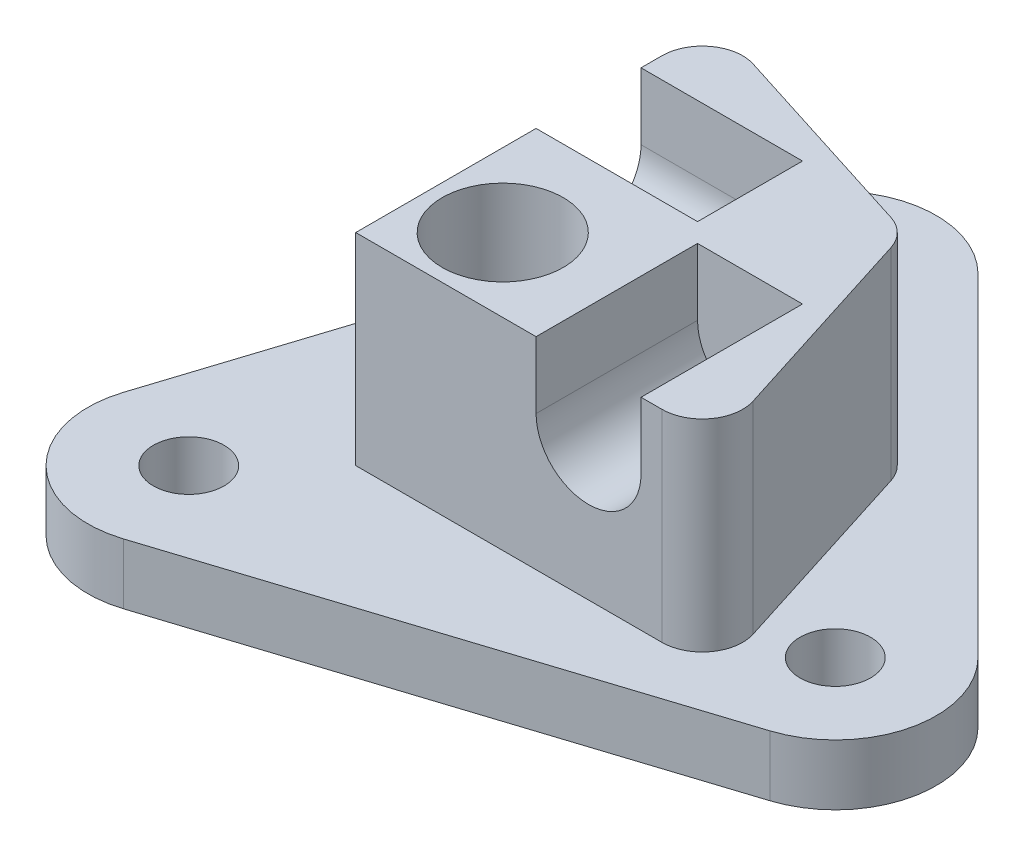
ISO-10303-21;
HEADER;
FILE_DESCRIPTION(('STEP AP214'),'2;1');
FILE_NAME('part.step','',(''),(''),'','','');
FILE_SCHEMA(('AUTOMOTIVE_DESIGN { 1 0 10303 214 1 1 1 1 }'));
ENDSEC;
DATA;
#1=APPLICATION_CONTEXT('core data for automotive mechanical design processes');
#2=APPLICATION_PROTOCOL_DEFINITION('international standard','automotive_design',2000,#1);
#3=PRODUCT_CONTEXT('',#1,'mechanical');
#4=PRODUCT('Part','Part','',(#3));
#5=PRODUCT_RELATED_PRODUCT_CATEGORY('part','',(#4));
#6=PRODUCT_DEFINITION_FORMATION('','',#4);
#7=PRODUCT_DEFINITION_CONTEXT('part definition',#1,'design');
#8=PRODUCT_DEFINITION('design','',#6,#7);
#9=PRODUCT_DEFINITION_SHAPE('','',#8);
#10=(LENGTH_UNIT() NAMED_UNIT(*) SI_UNIT(.MILLI.,.METRE.));
#11=(NAMED_UNIT(*) PLANE_ANGLE_UNIT() SI_UNIT($,.RADIAN.));
#12=(NAMED_UNIT(*) SI_UNIT($,.STERADIAN.) SOLID_ANGLE_UNIT());
#13=UNCERTAINTY_MEASURE_WITH_UNIT(LENGTH_MEASURE(1.E-05),#10,'distance_accuracy_value','');
#14=(GEOMETRIC_REPRESENTATION_CONTEXT(3) GLOBAL_UNCERTAINTY_ASSIGNED_CONTEXT((#13)) GLOBAL_UNIT_ASSIGNED_CONTEXT((#10,
#11,#12)) REPRESENTATION_CONTEXT('',''));
#15=CARTESIAN_POINT('',(0.,0.,0.));
#16=DIRECTION('',(0.,0.,1.));
#17=DIRECTION('',(1.,0.,0.));
#18=AXIS2_PLACEMENT_3D('',#15,#16,#17);
#19=CARTESIAN_POINT('',(0.,13.,-10.493));
#20=DIRECTION('',(0.,0.,1.));
#21=DIRECTION('',(1.,0.,0.));
#22=AXIS2_PLACEMENT_3D('',#19,#20,#21);
#23=PLANE('',#22);
#24=DIRECTION('',(0.,-1.,0.));
#25=VECTOR('',#24,1.);
#26=CARTESIAN_POINT('',(-3.64159276239827,13.,-10.493));
#27=LINE('',#26,#25);
#28=CARTESIAN_POINT('',(-3.64159276239827,13.,-10.493));
#29=VERTEX_POINT('',#28);
#30=CARTESIAN_POINT('',(-3.64159276239826,9.7,-10.493));
#31=VERTEX_POINT('',#30);
#32=EDGE_CURVE('E194',#29,#31,#27,.T.);
#33=ORIENTED_EDGE('',*,*,#32,.T.);
#34=DIRECTION('',(-1.,0.,0.));
#35=VECTOR('',#34,1.);
#36=CARTESIAN_POINT('',(21.4761737880842,9.7,-10.493));
#37=LINE('',#36,#35);
#38=CARTESIAN_POINT('',(4.35840723760174,9.7,-10.493));
#39=VERTEX_POINT('',#38);
#40=EDGE_CURVE('E180',#39,#31,#37,.T.);
#41=ORIENTED_EDGE('',*,*,#40,.F.);
#42=DIRECTION('',(0.,-1.,0.));
#43=VECTOR('',#42,1.);
#44=CARTESIAN_POINT('',(4.35840723760173,13.,-10.493));
#45=LINE('',#44,#43);
#46=CARTESIAN_POINT('',(4.35840723760173,13.,-10.493));
#47=VERTEX_POINT('',#46);
#48=EDGE_CURVE('E191',#47,#39,#45,.T.);
#49=ORIENTED_EDGE('',*,*,#48,.F.);
#50=DIRECTION('',(-1.,0.,0.));
#51=VECTOR('',#50,1.);
#52=CARTESIAN_POINT('',(0.,13.,-10.493));
#53=LINE('',#52,#51);
#54=EDGE_CURVE('E628',#47,#29,#53,.T.);
#55=ORIENTED_EDGE('',*,*,#54,.T.);
#56=EDGE_LOOP('',(#33,#41,#49,#55));
#57=FACE_BOUND('',#56,.T.);
#58=ADVANCED_FACE('F38',(#57),#23,.T.);
#59=CARTESIAN_POINT('',(0.,13.,-5.29300000000001));
#60=DIRECTION('',(0.,0.,1.));
#61=DIRECTION('',(1.,0.,0.));
#62=AXIS2_PLACEMENT_3D('',#59,#60,#61);
#63=PLANE('',#62);
#64=DIRECTION('',(-1.,0.,0.));
#65=VECTOR('',#64,1.);
#66=CARTESIAN_POINT('',(21.4761737880842,9.7,-5.293));
#67=LINE('',#66,#65);
#68=CARTESIAN_POINT('',(4.35840723760175,9.7,-5.293));
#69=VERTEX_POINT('',#68);
#70=CARTESIAN_POINT('',(-3.64159276239826,9.7,-5.293));
#71=VERTEX_POINT('',#70);
#72=EDGE_CURVE('E183',#69,#71,#67,.T.);
#73=ORIENTED_EDGE('',*,*,#72,.T.);
#74=DIRECTION('',(0.,-1.,0.));
#75=VECTOR('',#74,1.);
#76=CARTESIAN_POINT('',(-3.64159276239827,13.,-5.29300000000001));
#77=LINE('',#76,#75);
#78=CARTESIAN_POINT('',(-3.64159276239827,13.,-5.29300000000001));
#79=VERTEX_POINT('',#78);
#80=EDGE_CURVE('E205',#79,#71,#77,.T.);
#81=ORIENTED_EDGE('',*,*,#80,.F.);
#82=DIRECTION('',(-1.,0.,0.));
#83=VECTOR('',#82,1.);
#84=CARTESIAN_POINT('',(0.,13.,-5.29300000000001));
#85=LINE('',#84,#83);
#86=CARTESIAN_POINT('',(4.35840723760173,13.,-5.29300000000001));
#87=VERTEX_POINT('',#86);
#88=EDGE_CURVE('E616',#87,#79,#85,.T.);
#89=ORIENTED_EDGE('',*,*,#88,.F.);
#90=DIRECTION('',(0.,-1.,0.));
#91=VECTOR('',#90,1.);
#92=CARTESIAN_POINT('',(4.35840723760173,13.,-5.29300000000001));
#93=LINE('',#92,#91);
#94=EDGE_CURVE('E201',#87,#69,#93,.T.);
#95=ORIENTED_EDGE('',*,*,#94,.T.);
#96=EDGE_LOOP('',(#73,#81,#89,#95));
#97=FACE_BOUND('',#96,.T.);
#98=ADVANCED_FACE('F316',(#97),#63,.F.);
#99=CARTESIAN_POINT('',(0.,13.,-4.35840723760174));
#100=DIRECTION('',(0.,0.,-1.));
#101=DIRECTION('',(-1.,0.,0.));
#102=AXIS2_PLACEMENT_3D('',#99,#100,#101);
#103=PLANE('',#102);
#104=CARTESIAN_POINT('',(7.893,9.7,-4.35840723760174));
#105=DIRECTION('',(0.,0.,-1.));
#106=DIRECTION('',(-1.,0.,0.));
#107=AXIS2_PLACEMENT_3D('',#104,#105,#106);
#108=CIRCLE('',#107,2.6);
#109=CARTESIAN_POINT('',(5.293,9.7,-4.35840723760174));
#110=VERTEX_POINT('',#109);
#111=CARTESIAN_POINT('',(10.493,9.7,-4.35840723760174));
#112=VERTEX_POINT('',#111);
#113=EDGE_CURVE('E581',#110,#112,#108,.F.);
#114=ORIENTED_EDGE('',*,*,#113,.T.);
#115=DIRECTION('',(0.,-1.,0.));
#116=VECTOR('',#115,1.);
#117=CARTESIAN_POINT('',(10.493,13.,-4.35840723760174));
#118=LINE('',#117,#116);
#119=CARTESIAN_POINT('',(10.493,13.,-4.35840723760174));
#120=VERTEX_POINT('',#119);
#121=EDGE_CURVE('E602',#120,#112,#118,.T.);
#122=ORIENTED_EDGE('',*,*,#121,.F.);
#123=DIRECTION('',(1.,0.,0.));
#124=VECTOR('',#123,1.);
#125=CARTESIAN_POINT('',(0.,13.,-4.35840723760174));
#126=LINE('',#125,#124);
#127=CARTESIAN_POINT('',(5.293,13.,-4.35840723760174));
#128=VERTEX_POINT('',#127);
#129=EDGE_CURVE('E600',#128,#120,#126,.T.);
#130=ORIENTED_EDGE('',*,*,#129,.F.);
#131=DIRECTION('',(0.,-1.,0.));
#132=VECTOR('',#131,1.);
#133=CARTESIAN_POINT('',(5.293,13.,-4.35840723760174));
#134=LINE('',#133,#132);
#135=EDGE_CURVE('E594',#128,#110,#134,.T.);
#136=ORIENTED_EDGE('',*,*,#135,.T.);
#137=EDGE_LOOP('',(#114,#122,#130,#136));
#138=FACE_BOUND('',#137,.T.);
#139=ADVANCED_FACE('F321',(#138),#103,.F.);
#140=CARTESIAN_POINT('',(-7.77817459305202,3.,7.77817459305203));
#141=DIRECTION('',(0.,-1.,0.));
#142=DIRECTION('',(0.,0.,-1.));
#143=AXIS2_PLACEMENT_3D('',#140,#141,#142);
#144=CYLINDRICAL_SURFACE('',#143,5.);
#145=CARTESIAN_POINT('',(-7.77817459305202,0.,7.77817459305203));
#146=DIRECTION('',(0.,1.,0.));
#147=DIRECTION('',(0.,0.,1.));
#148=AXIS2_PLACEMENT_3D('',#145,#146,#147);
#149=CIRCLE('',#148,5.);
#150=CARTESIAN_POINT('',(-6.25119356190471,0.,12.539301448169));
#151=VERTEX_POINT('',#150);
#152=CARTESIAN_POINT('',(-12.539301448169,0.,6.25119356190473));
#153=VERTEX_POINT('',#152);
#154=EDGE_CURVE('E243',#151,#153,#149,.F.);
#155=ORIENTED_EDGE('',*,*,#154,.F.);
#156=DIRECTION('',(0.,-1.,0.));
#157=VECTOR('',#156,1.);
#158=CARTESIAN_POINT('',(-6.25119356190471,3.,12.539301448169));
#159=LINE('',#158,#157);
#160=CARTESIAN_POINT('',(-6.25119356190471,3.,12.539301448169));
#161=VERTEX_POINT('',#160);
#162=EDGE_CURVE('E11',#161,#151,#159,.T.);
#163=ORIENTED_EDGE('',*,*,#162,.F.);
#164=CARTESIAN_POINT('',(-7.77817459305202,3.,7.77817459305203));
#165=DIRECTION('',(0.,1.,0.));
#166=DIRECTION('',(0.,0.,1.));
#167=AXIS2_PLACEMENT_3D('',#164,#165,#166);
#168=CIRCLE('',#167,5.);
#169=CARTESIAN_POINT('',(-12.539301448169,3.,6.25119356190473));
#170=VERTEX_POINT('',#169);
#171=EDGE_CURVE('E218',#161,#170,#168,.F.);
#172=ORIENTED_EDGE('',*,*,#171,.T.);
#173=DIRECTION('',(0.,-1.,0.));
#174=VECTOR('',#173,1.);
#175=CARTESIAN_POINT('',(-12.539301448169,3.,6.25119356190473));
#176=LINE('',#175,#174);
#177=EDGE_CURVE('E237',#170,#153,#176,.T.);
#178=ORIENTED_EDGE('',*,*,#177,.T.);
#179=EDGE_LOOP('',(#155,#163,#172,#178));
#180=FACE_BOUND('',#179,.T.);
#181=ADVANCED_FACE('F287',(#180),#144,.T.);
#182=CARTESIAN_POINT('',(3.06347520775995,3.,9.5519156977955));
#183=DIRECTION('',(-0.305396206229444,0.,-0.952225371023406));
#184=DIRECTION('',(-0.952225371023406,0.,0.305396206229444));
#185=AXIS2_PLACEMENT_3D('',#182,#183,#184);
#186=PLANE('',#185);
#187=DIRECTION('',(0.952225371023406,0.,-0.305396206229444));
#188=VECTOR('',#187,1.);
#189=CARTESIAN_POINT('',(3.06347520775995,0.,9.5519156977955));
#190=LINE('',#189,#188);
#191=CARTESIAN_POINT('',(18.0011548192313,0.,4.76112685511704));
#192=VERTEX_POINT('',#191);
#193=EDGE_CURVE('E246',#151,#192,#190,.T.);
#194=ORIENTED_EDGE('',*,*,#193,.T.);
#195=DIRECTION('',(0.,-1.,0.));
#196=VECTOR('',#195,1.);
#197=CARTESIAN_POINT('',(18.0011548192313,3.,4.76112685511704));
#198=LINE('',#197,#196);
#199=CARTESIAN_POINT('',(18.0011548192313,3.,4.76112685511704));
#200=VERTEX_POINT('',#199);
#201=EDGE_CURVE('E46',#200,#192,#198,.T.);
#202=ORIENTED_EDGE('',*,*,#201,.F.);
#203=DIRECTION('',(0.952225371023406,0.,-0.305396206229444));
#204=VECTOR('',#203,1.);
#205=CARTESIAN_POINT('',(3.06347520775995,3.,9.5519156977955));
#206=LINE('',#205,#204);
#207=EDGE_CURVE('E221',#161,#200,#206,.T.);
#208=ORIENTED_EDGE('',*,*,#207,.F.);
#209=ORIENTED_EDGE('',*,*,#162,.T.);
#210=EDGE_LOOP('',(#194,#202,#208,#209));
#211=FACE_BOUND('',#210,.T.);
#212=ADVANCED_FACE('F281',(#211),#186,.F.);
#213=CARTESIAN_POINT('',(16.4741737880842,3.,0.));
#214=DIRECTION('',(0.,-1.,0.));
#215=DIRECTION('',(0.,0.,-1.));
#216=AXIS2_PLACEMENT_3D('',#213,#214,#215);
#217=CYLINDRICAL_SURFACE('',#216,5.);
#218=CARTESIAN_POINT('',(16.4741737880842,0.,0.));
#219=DIRECTION('',(0.,1.,0.));
#220=DIRECTION('',(0.,0.,1.));
#221=AXIS2_PLACEMENT_3D('',#218,#219,#220);
#222=CIRCLE('',#221,5.);
#223=CARTESIAN_POINT('',(20.0097076940169,0.,-3.53553390593279));
#224=VERTEX_POINT('',#223);
#225=EDGE_CURVE('E249',#192,#224,#222,.T.);
#226=ORIENTED_EDGE('',*,*,#225,.T.);
#227=DIRECTION('',(0.,-1.,0.));
#228=VECTOR('',#227,1.);
#229=CARTESIAN_POINT('',(20.0097076940169,3.,-3.53553390593279));
#230=LINE('',#229,#228);
#231=CARTESIAN_POINT('',(20.0097076940169,3.,-3.53553390593279));
#232=VERTEX_POINT('',#231);
#233=EDGE_CURVE('E272',#232,#224,#230,.T.);
#234=ORIENTED_EDGE('',*,*,#233,.F.);
#235=CARTESIAN_POINT('',(16.4741737880842,3.,0.));
#236=DIRECTION('',(0.,1.,0.));
#237=DIRECTION('',(0.,0.,1.));
#238=AXIS2_PLACEMENT_3D('',#235,#236,#237);
#239=CIRCLE('',#238,5.);
#240=EDGE_CURVE('E224',#200,#232,#239,.T.);
#241=ORIENTED_EDGE('',*,*,#240,.F.);
#242=ORIENTED_EDGE('',*,*,#201,.T.);
#243=EDGE_LOOP('',(#226,#234,#241,#242));
#244=FACE_BOUND('',#243,.T.);
#245=ADVANCED_FACE('F276',(#244),#217,.T.);
#246=CARTESIAN_POINT('',(11.7726207999748,3.,-11.7726207999748));
#247=DIRECTION('',(0.707106781186547,0.,-0.707106781186547));
#248=DIRECTION('',(-0.707106781186548,0.,-0.707106781186548));
#249=AXIS2_PLACEMENT_3D('',#246,#247,#248);
#250=PLANE('',#249);
#251=DIRECTION('',(0.707106781186548,0.,0.707106781186548));
#252=VECTOR('',#251,1.);
#253=CARTESIAN_POINT('',(11.7726207999748,0.,-11.7726207999748));
#254=LINE('',#253,#252);
#255=CARTESIAN_POINT('',(3.53553390593278,0.,-20.0097076940169));
#256=VERTEX_POINT('',#255);
#257=EDGE_CURVE('E252',#256,#224,#254,.T.);
#258=ORIENTED_EDGE('',*,*,#257,.F.);
#259=DIRECTION('',(0.,-1.,0.));
#260=VECTOR('',#259,1.);
#261=CARTESIAN_POINT('',(3.53553390593278,3.,-20.0097076940169));
#262=LINE('',#261,#260);
#263=CARTESIAN_POINT('',(3.53553390593278,3.,-20.0097076940169));
#264=VERTEX_POINT('',#263);
#265=EDGE_CURVE('E270',#264,#256,#262,.T.);
#266=ORIENTED_EDGE('',*,*,#265,.F.);
#267=DIRECTION('',(0.707106781186548,0.,0.707106781186548));
#268=VECTOR('',#267,1.);
#269=CARTESIAN_POINT('',(11.7726207999748,3.,-11.7726207999748));
#270=LINE('',#269,#268);
#271=EDGE_CURVE('E226',#264,#232,#270,.T.);
#272=ORIENTED_EDGE('',*,*,#271,.T.);
#273=ORIENTED_EDGE('',*,*,#233,.T.);
#274=EDGE_LOOP('',(#258,#266,#272,#273));
#275=FACE_BOUND('',#274,.T.);
#276=ADVANCED_FACE('F297',(#275),#250,.T.);
#277=CARTESIAN_POINT('',(0.,3.,-16.4741737880842));
#278=DIRECTION('',(0.,-1.,0.));
#279=DIRECTION('',(0.,0.,-1.));
#280=AXIS2_PLACEMENT_3D('',#277,#278,#279);
#281=CYLINDRICAL_SURFACE('',#280,5.);
#282=CARTESIAN_POINT('',(0.,0.,-16.4741737880842));
#283=DIRECTION('',(0.,1.,0.));
#284=DIRECTION('',(0.,0.,1.));
#285=AXIS2_PLACEMENT_3D('',#282,#283,#284);
#286=CIRCLE('',#285,5.);
#287=CARTESIAN_POINT('',(-4.76112685511705,0.,-18.0011548192313));
#288=VERTEX_POINT('',#287);
#289=EDGE_CURVE('E255',#256,#288,#286,.T.);
#290=ORIENTED_EDGE('',*,*,#289,.T.);
#291=DIRECTION('',(0.,-1.,0.));
#292=VECTOR('',#291,1.);
#293=CARTESIAN_POINT('',(-4.76112685511705,3.,-18.0011548192313));
#294=LINE('',#293,#292);
#295=CARTESIAN_POINT('',(-4.76112685511705,3.,-18.0011548192313));
#296=VERTEX_POINT('',#295);
#297=EDGE_CURVE('E267',#296,#288,#294,.T.);
#298=ORIENTED_EDGE('',*,*,#297,.F.);
#299=CARTESIAN_POINT('',(0.,3.,-16.4741737880842));
#300=DIRECTION('',(0.,1.,0.));
#301=DIRECTION('',(0.,0.,1.));
#302=AXIS2_PLACEMENT_3D('',#299,#300,#301);
#303=CIRCLE('',#302,5.);
#304=EDGE_CURVE('E229',#264,#296,#303,.T.);
#305=ORIENTED_EDGE('',*,*,#304,.F.);
#306=ORIENTED_EDGE('',*,*,#265,.T.);
#307=EDGE_LOOP('',(#290,#298,#305,#306));
#308=FACE_BOUND('',#307,.T.);
#309=ADVANCED_FACE('F303',(#308),#281,.T.);
#310=CARTESIAN_POINT('',(0.,3.,-16.4741737880842));
#311=DIRECTION('',(0.,-1.,0.));
#312=DIRECTION('',(0.,0.,-1.));
#313=AXIS2_PLACEMENT_3D('',#310,#311,#312);
#314=CYLINDRICAL_SURFACE('',#313,1.75);
#315=CARTESIAN_POINT('',(0.,3.,-16.4741737880842));
#316=DIRECTION('',(0.,1.,0.));
#317=DIRECTION('',(0.,0.,1.));
#318=AXIS2_PLACEMENT_3D('',#315,#316,#317);
#319=CIRCLE('',#318,1.75);
#320=CARTESIAN_POINT('',(0.,3.,-14.7241737880842));
#321=VERTEX_POINT('',#320);
#322=EDGE_CURVE('E234',#321,#321,#319,.F.);
#323=ORIENTED_EDGE('',*,*,#322,.F.);
#324=EDGE_LOOP('',(#323));
#325=FACE_BOUND('',#324,.T.);
#326=CARTESIAN_POINT('',(0.,0.,-16.4741737880842));
#327=DIRECTION('',(0.,1.,0.));
#328=DIRECTION('',(0.,0.,1.));
#329=AXIS2_PLACEMENT_3D('',#326,#327,#328);
#330=CIRCLE('',#329,1.75);
#331=CARTESIAN_POINT('',(0.,0.,-14.7241737880842));
#332=VERTEX_POINT('',#331);
#333=EDGE_CURVE('E261',#332,#332,#330,.F.);
#334=ORIENTED_EDGE('',*,*,#333,.T.);
#335=EDGE_LOOP('',(#334));
#336=FACE_BOUND('',#335,.T.);
#337=ADVANCED_FACE('F305',(#325,#336),#314,.F.);
#338=CARTESIAN_POINT('',(-9.55191569779549,3.,-3.06347520775994));
#339=DIRECTION('',(0.952225371023406,0.,0.305396206229444));
#340=DIRECTION('',(0.305396206229444,0.,-0.952225371023406));
#341=AXIS2_PLACEMENT_3D('',#338,#339,#340);
#342=PLANE('',#341);
#343=DIRECTION('',(-0.305396206229444,0.,0.952225371023406));
#344=VECTOR('',#343,1.);
#345=CARTESIAN_POINT('',(-9.55191569779549,0.,-3.06347520775994));
#346=LINE('',#345,#344);
#347=EDGE_CURVE('E258',#288,#153,#346,.T.);
#348=ORIENTED_EDGE('',*,*,#347,.T.);
#349=ORIENTED_EDGE('',*,*,#177,.F.);
#350=DIRECTION('',(-0.305396206229444,0.,0.952225371023406));
#351=VECTOR('',#350,1.);
#352=CARTESIAN_POINT('',(-9.55191569779549,3.,-3.06347520775994));
#353=LINE('',#352,#351);
#354=EDGE_CURVE('E232',#296,#170,#353,.T.);
#355=ORIENTED_EDGE('',*,*,#354,.F.);
#356=ORIENTED_EDGE('',*,*,#297,.T.);
#357=EDGE_LOOP('',(#348,#349,#355,#356));
#358=FACE_BOUND('',#357,.T.);
#359=ADVANCED_FACE('F291',(#358),#342,.F.);
#360=CARTESIAN_POINT('',(-7.77817459305202,3.,7.77817459305203));
#361=DIRECTION('',(0.,-1.,0.));
#362=DIRECTION('',(0.,0.,-1.));
#363=AXIS2_PLACEMENT_3D('',#360,#361,#362);
#364=CYLINDRICAL_SURFACE('',#363,1.75);
#365=CARTESIAN_POINT('',(-7.77817459305202,3.,7.77817459305203));
#366=DIRECTION('',(0.,1.,0.));
#367=DIRECTION('',(0.,0.,1.));
#368=AXIS2_PLACEMENT_3D('',#365,#366,#367);
#369=CIRCLE('',#368,1.75);
#370=CARTESIAN_POINT('',(-7.77817459305202,3.,9.52817459305203));
#371=VERTEX_POINT('',#370);
#372=EDGE_CURVE('E214',#371,#371,#369,.T.);
#373=ORIENTED_EDGE('',*,*,#372,.T.);
#374=EDGE_LOOP('',(#373));
#375=FACE_BOUND('',#374,.T.);
#376=CARTESIAN_POINT('',(-7.77817459305202,0.,7.77817459305203));
#377=DIRECTION('',(0.,1.,0.));
#378=DIRECTION('',(0.,0.,1.));
#379=AXIS2_PLACEMENT_3D('',#376,#377,#378);
#380=CIRCLE('',#379,1.75);
#381=CARTESIAN_POINT('',(-7.77817459305202,0.,9.52817459305203));
#382=VERTEX_POINT('',#381);
#383=EDGE_CURVE('E240',#382,#382,#380,.T.);
#384=ORIENTED_EDGE('',*,*,#383,.F.);
#385=EDGE_LOOP('',(#384));
#386=FACE_BOUND('',#385,.T.);
#387=ADVANCED_FACE('F342',(#375,#386),#364,.F.);
#388=CARTESIAN_POINT('',(16.4741737880842,3.,0.));
#389=DIRECTION('',(0.,-1.,0.));
#390=DIRECTION('',(0.,0.,-1.));
#391=AXIS2_PLACEMENT_3D('',#388,#389,#390);
#392=CYLINDRICAL_SURFACE('',#391,1.75);
#393=CARTESIAN_POINT('',(16.4741737880842,3.,0.));
#394=DIRECTION('',(0.,1.,0.));
#395=DIRECTION('',(0.,0.,1.));
#396=AXIS2_PLACEMENT_3D('',#393,#394,#395);
#397=CIRCLE('',#396,1.75);
#398=CARTESIAN_POINT('',(16.4741737880842,3.,1.75));
#399=VERTEX_POINT('',#398);
#400=EDGE_CURVE('E211',#399,#399,#397,.T.);
#401=ORIENTED_EDGE('',*,*,#400,.T.);
#402=EDGE_LOOP('',(#401));
#403=FACE_BOUND('',#402,.T.);
#404=CARTESIAN_POINT('',(16.4741737880842,0.,0.));
#405=DIRECTION('',(0.,1.,0.));
#406=DIRECTION('',(0.,0.,1.));
#407=AXIS2_PLACEMENT_3D('',#404,#405,#406);
#408=CIRCLE('',#407,1.75);
#409=CARTESIAN_POINT('',(16.4741737880842,0.,1.75));
#410=VERTEX_POINT('',#409);
#411=EDGE_CURVE('E210',#410,#410,#408,.T.);
#412=ORIENTED_EDGE('',*,*,#411,.F.);
#413=EDGE_LOOP('',(#412));
#414=FACE_BOUND('',#413,.T.);
#415=ADVANCED_FACE('F40',(#403,#414),#392,.F.);
#416=CARTESIAN_POINT('',(0.,3.,0.));
#417=DIRECTION('',(0.,-1.,0.));
#418=DIRECTION('',(0.,0.,-1.));
#419=AXIS2_PLACEMENT_3D('',#416,#417,#418);
#420=CYLINDRICAL_SURFACE('',#419,3.);
#421=CARTESIAN_POINT('',(0.,0.,0.));
#422=DIRECTION('',(0.,1.,0.));
#423=DIRECTION('',(0.,0.,1.));
#424=AXIS2_PLACEMENT_3D('',#421,#422,#423);
#425=CIRCLE('',#424,3.);
#426=CARTESIAN_POINT('',(0.,0.,3.));
#427=VERTEX_POINT('',#426);
#428=EDGE_CURVE('E215',#427,#427,#425,.T.);
#429=ORIENTED_EDGE('',*,*,#428,.F.);
#430=EDGE_LOOP('',(#429));
#431=FACE_BOUND('',#430,.T.);
#432=CARTESIAN_POINT('',(0.,13.,0.));
#433=DIRECTION('',(0.,1.,0.));
#434=DIRECTION('',(0.,0.,1.));
#435=AXIS2_PLACEMENT_3D('',#432,#433,#434);
#436=CIRCLE('',#435,3.);
#437=CARTESIAN_POINT('',(0.,13.,3.));
#438=VERTEX_POINT('',#437);
#439=EDGE_CURVE('E652',#438,#438,#436,.F.);
#440=ORIENTED_EDGE('',*,*,#439,.F.);
#441=EDGE_LOOP('',(#440));
#442=FACE_BOUND('',#441,.T.);
#443=ADVANCED_FACE('F335',(#431,#442),#420,.F.);
#444=CARTESIAN_POINT('',(0.,3.,0.));
#445=DIRECTION('',(0.,1.,0.));
#446=DIRECTION('',(0.,0.,1.));
#447=AXIS2_PLACEMENT_3D('',#444,#445,#446);
#448=PLANE('',#447);
#449=DIRECTION('',(1.,0.,0.));
#450=VECTOR('',#449,1.);
#451=CARTESIAN_POINT('',(0.,3.,3.64159276239826));
#452=LINE('',#451,#450);
#453=CARTESIAN_POINT('',(-3.64159276239827,3.,3.64159276239826));
#454=VERTEX_POINT('',#453);
#455=CARTESIAN_POINT('',(11.5299801128555,3.,3.64159276239826));
#456=VERTEX_POINT('',#455);
#457=EDGE_CURVE('E658',#454,#456,#452,.T.);
#458=ORIENTED_EDGE('',*,*,#457,.F.);
#459=DIRECTION('',(0.,0.,1.));
#460=VECTOR('',#459,1.);
#461=CARTESIAN_POINT('',(-3.64159276239827,3.,0.));
#462=LINE('',#461,#460);
#463=CARTESIAN_POINT('',(-3.64159276239827,3.,-11.5299801128555));
#464=VERTEX_POINT('',#463);
#465=EDGE_CURVE('E53',#464,#454,#462,.T.);
#466=ORIENTED_EDGE('',*,*,#465,.F.);
#467=CARTESIAN_POINT('',(-1.64159276239827,3.,-11.5299801128555));
#468=DIRECTION('',(0.,1.,0.));
#469=DIRECTION('',(0.,0.,1.));
#470=AXIS2_PLACEMENT_3D('',#467,#468,#469);
#471=CIRCLE('',#470,2.);
#472=CARTESIAN_POINT('',(-1.03695933041488,3.,-13.4363951812307));
#473=VERTEX_POINT('',#472);
#474=EDGE_CURVE('E590',#464,#473,#471,.F.);
#475=ORIENTED_EDGE('',*,*,#474,.T.);
#476=DIRECTION('',(0.953207534187596,0.,0.302316715991695));
#477=VECTOR('',#476,1.);
#478=CARTESIAN_POINT('',(3.77720036741712,3.,-11.9095493497523));
#479=LINE('',#478,#477);
#480=CARTESIAN_POINT('',(8.96304066958512,3.,-10.2648223059769));
#481=VERTEX_POINT('',#480);
#482=EDGE_CURVE('E626',#473,#481,#479,.T.);
#483=ORIENTED_EDGE('',*,*,#482,.T.);
#484=CARTESIAN_POINT('',(8.35840723760173,3.,-8.35840723760174));
#485=DIRECTION('',(0.,1.,0.));
#486=DIRECTION('',(0.,0.,1.));
#487=AXIS2_PLACEMENT_3D('',#484,#485,#486);
#488=CIRCLE('',#487,2.);
#489=CARTESIAN_POINT('',(10.2648223059769,3.,-8.96304066958512));
#490=VERTEX_POINT('',#489);
#491=EDGE_CURVE('E666',#481,#490,#488,.F.);
#492=ORIENTED_EDGE('',*,*,#491,.T.);
#493=DIRECTION('',(-0.302316715991695,0.,-0.953207534187596));
#494=VECTOR('',#493,1.);
#495=CARTESIAN_POINT('',(11.9095493497523,3.,-3.77720036741712));
#496=LINE('',#495,#494);
#497=CARTESIAN_POINT('',(13.4363951812307,3.,1.03695933041487));
#498=VERTEX_POINT('',#497);
#499=EDGE_CURVE('E663',#498,#490,#496,.T.);
#500=ORIENTED_EDGE('',*,*,#499,.F.);
#501=CARTESIAN_POINT('',(11.5299801128555,3.,1.64159276239827));
#502=DIRECTION('',(0.,1.,0.));
#503=DIRECTION('',(0.,0.,1.));
#504=AXIS2_PLACEMENT_3D('',#501,#502,#503);
#505=CIRCLE('',#504,2.);
#506=EDGE_CURVE('E660',#456,#498,#505,.T.);
#507=ORIENTED_EDGE('',*,*,#506,.F.);
#508=EDGE_LOOP('',(#458,#466,#475,#483,#492,#500,#507));
#509=FACE_BOUND('',#508,.T.);
#510=ORIENTED_EDGE('',*,*,#400,.F.);
#511=EDGE_LOOP('',(#510));
#512=FACE_BOUND('',#511,.T.);
#513=ORIENTED_EDGE('',*,*,#372,.F.);
#514=EDGE_LOOP('',(#513));
#515=FACE_BOUND('',#514,.T.);
#516=ORIENTED_EDGE('',*,*,#171,.F.);
#517=ORIENTED_EDGE('',*,*,#207,.T.);
#518=ORIENTED_EDGE('',*,*,#240,.T.);
#519=ORIENTED_EDGE('',*,*,#271,.F.);
#520=ORIENTED_EDGE('',*,*,#304,.T.);
#521=ORIENTED_EDGE('',*,*,#354,.T.);
#522=EDGE_LOOP('',(#516,#517,#518,#519,#520,#521));
#523=FACE_BOUND('',#522,.T.);
#524=ORIENTED_EDGE('',*,*,#322,.T.);
#525=EDGE_LOOP('',(#524));
#526=FACE_BOUND('',#525,.T.);
#527=ADVANCED_FACE('F301',(#509,#512,#515,#523,#526),#448,.T.);
#528=CARTESIAN_POINT('',(0.,0.,0.));
#529=DIRECTION('',(0.,1.,0.));
#530=DIRECTION('',(0.,0.,1.));
#531=AXIS2_PLACEMENT_3D('',#528,#529,#530);
#532=PLANE('',#531);
#533=ORIENTED_EDGE('',*,*,#411,.T.);
#534=EDGE_LOOP('',(#533));
#535=FACE_BOUND('',#534,.T.);
#536=ORIENTED_EDGE('',*,*,#383,.T.);
#537=EDGE_LOOP('',(#536));
#538=FACE_BOUND('',#537,.T.);
#539=ORIENTED_EDGE('',*,*,#154,.T.);
#540=ORIENTED_EDGE('',*,*,#347,.F.);
#541=ORIENTED_EDGE('',*,*,#289,.F.);
#542=ORIENTED_EDGE('',*,*,#257,.T.);
#543=ORIENTED_EDGE('',*,*,#225,.F.);
#544=ORIENTED_EDGE('',*,*,#193,.F.);
#545=EDGE_LOOP('',(#539,#540,#541,#542,#543,#544));
#546=FACE_BOUND('',#545,.T.);
#547=ORIENTED_EDGE('',*,*,#333,.F.);
#548=EDGE_LOOP('',(#547));
#549=FACE_BOUND('',#548,.T.);
#550=ORIENTED_EDGE('',*,*,#428,.T.);
#551=EDGE_LOOP('',(#550));
#552=FACE_BOUND('',#551,.T.);
#553=ADVANCED_FACE('F284',(#535,#538,#546,#549,#552),#532,.F.);
#554=CARTESIAN_POINT('',(-1.64159276239827,13.,-11.5299801128555));
#555=DIRECTION('',(0.,-1.,0.));
#556=DIRECTION('',(0.,0.,-1.));
#557=AXIS2_PLACEMENT_3D('',#554,#555,#556);
#558=CYLINDRICAL_SURFACE('',#557,2.);
#559=ORIENTED_EDGE('',*,*,#474,.F.);
#560=DIRECTION('',(0.,-1.,0.));
#561=VECTOR('',#560,1.);
#562=CARTESIAN_POINT('',(-3.64159276239827,13.,-11.5299801128555));
#563=LINE('',#562,#561);
#564=CARTESIAN_POINT('',(-3.64159276239827,13.,-11.5299801128555));
#565=VERTEX_POINT('',#564);
#566=EDGE_CURVE('E203',#565,#464,#563,.T.);
#567=ORIENTED_EDGE('',*,*,#566,.F.);
#568=CARTESIAN_POINT('',(-1.64159276239827,13.,-11.5299801128555));
#569=DIRECTION('',(0.,1.,0.));
#570=DIRECTION('',(0.,0.,1.));
#571=AXIS2_PLACEMENT_3D('',#568,#569,#570);
#572=CIRCLE('',#571,2.);
#573=CARTESIAN_POINT('',(-1.03695933041488,13.,-13.4363951812307));
#574=VERTEX_POINT('',#573);
#575=EDGE_CURVE('E622',#565,#574,#572,.F.);
#576=ORIENTED_EDGE('',*,*,#575,.T.);
#577=DIRECTION('',(0.,-1.,0.));
#578=VECTOR('',#577,1.);
#579=CARTESIAN_POINT('',(-1.03695933041488,13.,-13.4363951812307));
#580=LINE('',#579,#578);
#581=EDGE_CURVE('E655',#574,#473,#580,.T.);
#582=ORIENTED_EDGE('',*,*,#581,.T.);
#583=EDGE_LOOP('',(#559,#567,#576,#582));
#584=FACE_BOUND('',#583,.T.);
#585=ADVANCED_FACE('F329',(#584),#558,.T.);
#586=CARTESIAN_POINT('',(-3.64159276239827,13.,0.));
#587=DIRECTION('',(1.,0.,0.));
#588=DIRECTION('',(0.,0.,-1.));
#589=AXIS2_PLACEMENT_3D('',#586,#587,#588);
#590=PLANE('',#589);
#591=ORIENTED_EDGE('',*,*,#465,.T.);
#592=DIRECTION('',(0.,-1.,0.));
#593=VECTOR('',#592,1.);
#594=CARTESIAN_POINT('',(-3.64159276239827,13.,3.64159276239826));
#595=LINE('',#594,#593);
#596=CARTESIAN_POINT('',(-3.64159276239827,13.,3.64159276239826));
#597=VERTEX_POINT('',#596);
#598=EDGE_CURVE('E604',#597,#454,#595,.T.);
#599=ORIENTED_EDGE('',*,*,#598,.F.);
#600=DIRECTION('',(0.,0.,1.));
#601=VECTOR('',#600,1.);
#602=CARTESIAN_POINT('',(-3.64159276239827,13.,0.));
#603=LINE('',#602,#601);
#604=EDGE_CURVE('E614',#79,#597,#603,.T.);
#605=ORIENTED_EDGE('',*,*,#604,.F.);
#606=ORIENTED_EDGE('',*,*,#80,.T.);
#607=CARTESIAN_POINT('',(-3.64159276239826,9.7,-7.893));
#608=DIRECTION('',(1.,0.,0.));
#609=DIRECTION('',(0.,0.,-1.));
#610=AXIS2_PLACEMENT_3D('',#607,#608,#609);
#611=CIRCLE('',#610,2.6);
#612=EDGE_CURVE('E195',#71,#31,#611,.T.);
#613=ORIENTED_EDGE('',*,*,#612,.T.);
#614=ORIENTED_EDGE('',*,*,#32,.F.);
#615=DIRECTION('',(0.,0.,1.));
#616=VECTOR('',#615,1.);
#617=CARTESIAN_POINT('',(-3.64159276239827,13.,0.));
#618=LINE('',#617,#616);
#619=EDGE_CURVE('E625',#565,#29,#618,.T.);
#620=ORIENTED_EDGE('',*,*,#619,.F.);
#621=ORIENTED_EDGE('',*,*,#566,.T.);
#622=EDGE_LOOP('',(#591,#599,#605,#606,#613,#614,#620,#621));
#623=FACE_BOUND('',#622,.T.);
#624=ADVANCED_FACE('F326',(#623),#590,.F.);
#625=CARTESIAN_POINT('',(4.35840723760173,13.,0.));
#626=DIRECTION('',(-1.,0.,0.));
#627=DIRECTION('',(0.,0.,1.));
#628=AXIS2_PLACEMENT_3D('',#625,#626,#627);
#629=PLANE('',#628);
#630=CARTESIAN_POINT('',(4.35840723760173,9.7,-7.893));
#631=DIRECTION('',(-1.,0.,0.));
#632=DIRECTION('',(0.,0.,1.));
#633=AXIS2_PLACEMENT_3D('',#630,#631,#632);
#634=CIRCLE('',#633,2.6);
#635=EDGE_CURVE('E177',#39,#69,#634,.T.);
#636=ORIENTED_EDGE('',*,*,#635,.T.);
#637=ORIENTED_EDGE('',*,*,#94,.F.);
#638=DIRECTION('',(0.,0.,-1.));
#639=VECTOR('',#638,1.);
#640=CARTESIAN_POINT('',(4.35840723760173,13.,0.));
#641=LINE('',#640,#639);
#642=EDGE_CURVE('E200',#87,#47,#641,.T.);
#643=ORIENTED_EDGE('',*,*,#642,.T.);
#644=ORIENTED_EDGE('',*,*,#48,.T.);
#645=EDGE_LOOP('',(#636,#637,#643,#644));
#646=FACE_BOUND('',#645,.T.);
#647=ADVANCED_FACE('F198',(#646),#629,.T.);
#648=CARTESIAN_POINT('',(0.,13.,3.64159276239826));
#649=DIRECTION('',(0.,0.,-1.));
#650=DIRECTION('',(-1.,0.,0.));
#651=AXIS2_PLACEMENT_3D('',#648,#649,#650);
#652=PLANE('',#651);
#653=ORIENTED_EDGE('',*,*,#457,.T.);
#654=DIRECTION('',(0.,-1.,0.));
#655=VECTOR('',#654,1.);
#656=CARTESIAN_POINT('',(11.5299801128555,13.,3.64159276239827));
#657=LINE('',#656,#655);
#658=CARTESIAN_POINT('',(11.5299801128555,13.,3.64159276239827));
#659=VERTEX_POINT('',#658);
#660=EDGE_CURVE('E680',#659,#456,#657,.T.);
#661=ORIENTED_EDGE('',*,*,#660,.F.);
#662=DIRECTION('',(1.,0.,0.));
#663=VECTOR('',#662,1.);
#664=CARTESIAN_POINT('',(0.,13.,3.64159276239826));
#665=LINE('',#664,#663);
#666=CARTESIAN_POINT('',(10.493,13.,3.64159276239827));
#667=VERTEX_POINT('',#666);
#668=EDGE_CURVE('E640',#667,#659,#665,.T.);
#669=ORIENTED_EDGE('',*,*,#668,.F.);
#670=DIRECTION('',(0.,-1.,0.));
#671=VECTOR('',#670,1.);
#672=CARTESIAN_POINT('',(10.493,13.,3.64159276239827));
#673=LINE('',#672,#671);
#674=CARTESIAN_POINT('',(10.493,9.7,3.64159276239826));
#675=VERTEX_POINT('',#674);
#676=EDGE_CURVE('E606',#667,#675,#673,.T.);
#677=ORIENTED_EDGE('',*,*,#676,.T.);
#678=CARTESIAN_POINT('',(7.893,9.7,3.64159276239826));
#679=DIRECTION('',(0.,0.,1.));
#680=DIRECTION('',(1.,0.,0.));
#681=AXIS2_PLACEMENT_3D('',#678,#679,#680);
#682=CIRCLE('',#681,2.6);
#683=CARTESIAN_POINT('',(5.293,9.7,3.64159276239826));
#684=VERTEX_POINT('',#683);
#685=EDGE_CURVE('E598',#684,#675,#682,.T.);
#686=ORIENTED_EDGE('',*,*,#685,.F.);
#687=DIRECTION('',(0.,-1.,0.));
#688=VECTOR('',#687,1.);
#689=CARTESIAN_POINT('',(5.293,13.,3.64159276239826));
#690=LINE('',#689,#688);
#691=CARTESIAN_POINT('',(5.293,13.,3.64159276239826));
#692=VERTEX_POINT('',#691);
#693=EDGE_CURVE('E597',#692,#684,#690,.T.);
#694=ORIENTED_EDGE('',*,*,#693,.F.);
#695=DIRECTION('',(1.,0.,0.));
#696=VECTOR('',#695,1.);
#697=CARTESIAN_POINT('',(0.,13.,3.64159276239826));
#698=LINE('',#697,#696);
#699=EDGE_CURVE('E633',#597,#692,#698,.T.);
#700=ORIENTED_EDGE('',*,*,#699,.F.);
#701=ORIENTED_EDGE('',*,*,#598,.T.);
#702=EDGE_LOOP('',(#653,#661,#669,#677,#686,#694,#700,#701));
#703=FACE_BOUND('',#702,.T.);
#704=ADVANCED_FACE('F484',(#703),#652,.F.);
#705=CARTESIAN_POINT('',(5.293,13.,0.));
#706=DIRECTION('',(1.,0.,0.));
#707=DIRECTION('',(0.,0.,-1.));
#708=AXIS2_PLACEMENT_3D('',#705,#706,#707);
#709=PLANE('',#708);
#710=DIRECTION('',(0.,0.,1.));
#711=VECTOR('',#710,1.);
#712=CARTESIAN_POINT('',(5.293,9.7,-21.4761737880842));
#713=LINE('',#712,#711);
#714=EDGE_CURVE('E583',#110,#684,#713,.T.);
#715=ORIENTED_EDGE('',*,*,#714,.F.);
#716=ORIENTED_EDGE('',*,*,#135,.F.);
#717=DIRECTION('',(0.,0.,1.));
#718=VECTOR('',#717,1.);
#719=CARTESIAN_POINT('',(5.293,13.,0.));
#720=LINE('',#719,#718);
#721=EDGE_CURVE('E635',#128,#692,#720,.T.);
#722=ORIENTED_EDGE('',*,*,#721,.T.);
#723=ORIENTED_EDGE('',*,*,#693,.T.);
#724=EDGE_LOOP('',(#715,#716,#722,#723));
#725=FACE_BOUND('',#724,.T.);
#726=ADVANCED_FACE('F489',(#725),#709,.T.);
#727=CARTESIAN_POINT('',(10.493,13.,0.));
#728=DIRECTION('',(1.,0.,0.));
#729=DIRECTION('',(0.,0.,-1.));
#730=AXIS2_PLACEMENT_3D('',#727,#728,#729);
#731=PLANE('',#730);
#732=ORIENTED_EDGE('',*,*,#121,.T.);
#733=DIRECTION('',(0.,0.,1.));
#734=VECTOR('',#733,1.);
#735=CARTESIAN_POINT('',(10.493,9.7,-21.4761737880842));
#736=LINE('',#735,#734);
#737=EDGE_CURVE('E586',#112,#675,#736,.T.);
#738=ORIENTED_EDGE('',*,*,#737,.T.);
#739=ORIENTED_EDGE('',*,*,#676,.F.);
#740=DIRECTION('',(0.,0.,1.));
#741=VECTOR('',#740,1.);
#742=CARTESIAN_POINT('',(10.493,13.,0.));
#743=LINE('',#742,#741);
#744=EDGE_CURVE('E638',#120,#667,#743,.T.);
#745=ORIENTED_EDGE('',*,*,#744,.F.);
#746=EDGE_LOOP('',(#732,#738,#739,#745));
#747=FACE_BOUND('',#746,.T.);
#748=ADVANCED_FACE('F423',(#747),#731,.F.);
#749=CARTESIAN_POINT('',(11.5299801128555,13.,1.64159276239827));
#750=DIRECTION('',(0.,-1.,0.));
#751=DIRECTION('',(0.,0.,-1.));
#752=AXIS2_PLACEMENT_3D('',#749,#750,#751);
#753=CYLINDRICAL_SURFACE('',#752,2.);
#754=ORIENTED_EDGE('',*,*,#506,.T.);
#755=DIRECTION('',(0.,-1.,0.));
#756=VECTOR('',#755,1.);
#757=CARTESIAN_POINT('',(13.4363951812307,13.,1.03695933041487));
#758=LINE('',#757,#756);
#759=CARTESIAN_POINT('',(13.4363951812307,13.,1.03695933041487));
#760=VERTEX_POINT('',#759);
#761=EDGE_CURVE('E677',#760,#498,#758,.T.);
#762=ORIENTED_EDGE('',*,*,#761,.F.);
#763=CARTESIAN_POINT('',(11.5299801128555,13.,1.64159276239827));
#764=DIRECTION('',(0.,1.,0.));
#765=DIRECTION('',(0.,0.,1.));
#766=AXIS2_PLACEMENT_3D('',#763,#764,#765);
#767=CIRCLE('',#766,2.);
#768=EDGE_CURVE('E642',#659,#760,#767,.T.);
#769=ORIENTED_EDGE('',*,*,#768,.F.);
#770=ORIENTED_EDGE('',*,*,#660,.T.);
#771=EDGE_LOOP('',(#754,#762,#769,#770));
#772=FACE_BOUND('',#771,.T.);
#773=ADVANCED_FACE('F417',(#772),#753,.T.);
#774=CARTESIAN_POINT('',(11.9095493497523,13.,-3.77720036741712));
#775=DIRECTION('',(-0.953207534187596,0.,0.302316715991695));
#776=DIRECTION('',(0.302316715991695,0.,0.953207534187596));
#777=AXIS2_PLACEMENT_3D('',#774,#775,#776);
#778=PLANE('',#777);
#779=ORIENTED_EDGE('',*,*,#499,.T.);
#780=DIRECTION('',(0.,-1.,0.));
#781=VECTOR('',#780,1.);
#782=CARTESIAN_POINT('',(10.2648223059769,13.,-8.96304066958512));
#783=LINE('',#782,#781);
#784=CARTESIAN_POINT('',(10.2648223059769,13.,-8.96304066958512));
#785=VERTEX_POINT('',#784);
#786=EDGE_CURVE('E674',#785,#490,#783,.T.);
#787=ORIENTED_EDGE('',*,*,#786,.F.);
#788=DIRECTION('',(-0.302316715991695,0.,-0.953207534187596));
#789=VECTOR('',#788,1.);
#790=CARTESIAN_POINT('',(11.9095493497523,13.,-3.77720036741712));
#791=LINE('',#790,#789);
#792=EDGE_CURVE('E644',#760,#785,#791,.T.);
#793=ORIENTED_EDGE('',*,*,#792,.F.);
#794=ORIENTED_EDGE('',*,*,#761,.T.);
#795=EDGE_LOOP('',(#779,#787,#793,#794));
#796=FACE_BOUND('',#795,.T.);
#797=ADVANCED_FACE('F422',(#796),#778,.F.);
#798=CARTESIAN_POINT('',(8.35840723760173,13.,-8.35840723760174));
#799=DIRECTION('',(0.,-1.,0.));
#800=DIRECTION('',(0.,0.,-1.));
#801=AXIS2_PLACEMENT_3D('',#798,#799,#800);
#802=CYLINDRICAL_SURFACE('',#801,2.);
#803=ORIENTED_EDGE('',*,*,#491,.F.);
#804=DIRECTION('',(0.,-1.,0.));
#805=VECTOR('',#804,1.);
#806=CARTESIAN_POINT('',(8.96304066958512,13.,-10.2648223059769));
#807=LINE('',#806,#805);
#808=CARTESIAN_POINT('',(8.96304066958512,13.,-10.2648223059769));
#809=VERTEX_POINT('',#808);
#810=EDGE_CURVE('E671',#809,#481,#807,.T.);
#811=ORIENTED_EDGE('',*,*,#810,.F.);
#812=CARTESIAN_POINT('',(8.35840723760173,13.,-8.35840723760174));
#813=DIRECTION('',(0.,1.,0.));
#814=DIRECTION('',(0.,0.,1.));
#815=AXIS2_PLACEMENT_3D('',#812,#813,#814);
#816=CIRCLE('',#815,2.);
#817=EDGE_CURVE('E646',#809,#785,#816,.F.);
#818=ORIENTED_EDGE('',*,*,#817,.T.);
#819=ORIENTED_EDGE('',*,*,#786,.T.);
#820=EDGE_LOOP('',(#803,#811,#818,#819));
#821=FACE_BOUND('',#820,.T.);
#822=ADVANCED_FACE('F435',(#821),#802,.T.);
#823=CARTESIAN_POINT('',(3.77720036741712,13.,-11.9095493497523));
#824=DIRECTION('',(0.302316715991695,0.,-0.953207534187596));
#825=DIRECTION('',(-0.953207534187596,0.,-0.302316715991695));
#826=AXIS2_PLACEMENT_3D('',#823,#824,#825);
#827=PLANE('',#826);
#828=ORIENTED_EDGE('',*,*,#482,.F.);
#829=ORIENTED_EDGE('',*,*,#581,.F.);
#830=DIRECTION('',(0.953207534187596,0.,0.302316715991695));
#831=VECTOR('',#830,1.);
#832=CARTESIAN_POINT('',(3.77720036741712,13.,-11.9095493497523));
#833=LINE('',#832,#831);
#834=EDGE_CURVE('E649',#574,#809,#833,.T.);
#835=ORIENTED_EDGE('',*,*,#834,.T.);
#836=ORIENTED_EDGE('',*,*,#810,.T.);
#837=EDGE_LOOP('',(#828,#829,#835,#836));
#838=FACE_BOUND('',#837,.T.);
#839=ADVANCED_FACE('F445',(#838),#827,.T.);
#840=CARTESIAN_POINT('',(0.,13.,0.));
#841=DIRECTION('',(0.,1.,0.));
#842=DIRECTION('',(0.,0.,1.));
#843=AXIS2_PLACEMENT_3D('',#840,#841,#842);
#844=PLANE('',#843);
#845=ORIENTED_EDGE('',*,*,#575,.F.);
#846=ORIENTED_EDGE('',*,*,#619,.T.);
#847=ORIENTED_EDGE('',*,*,#54,.F.);
#848=ORIENTED_EDGE('',*,*,#642,.F.);
#849=ORIENTED_EDGE('',*,*,#88,.T.);
#850=ORIENTED_EDGE('',*,*,#604,.T.);
#851=ORIENTED_EDGE('',*,*,#699,.T.);
#852=ORIENTED_EDGE('',*,*,#721,.F.);
#853=ORIENTED_EDGE('',*,*,#129,.T.);
#854=ORIENTED_EDGE('',*,*,#744,.T.);
#855=ORIENTED_EDGE('',*,*,#668,.T.);
#856=ORIENTED_EDGE('',*,*,#768,.T.);
#857=ORIENTED_EDGE('',*,*,#792,.T.);
#858=ORIENTED_EDGE('',*,*,#817,.F.);
#859=ORIENTED_EDGE('',*,*,#834,.F.);
#860=EDGE_LOOP('',(#845,#846,#847,#848,#849,#850,#851,#852,#853,#854,#855,#856,#857,#858,#859));
#861=FACE_BOUND('',#860,.T.);
#862=ORIENTED_EDGE('',*,*,#439,.T.);
#863=EDGE_LOOP('',(#862));
#864=FACE_BOUND('',#863,.T.);
#865=ADVANCED_FACE('F455',(#861,#864),#844,.T.);
#866=CARTESIAN_POINT('',(7.893,9.7,-21.4761737880842));
#867=DIRECTION('',(0.,0.,1.));
#868=DIRECTION('',(1.,0.,0.));
#869=AXIS2_PLACEMENT_3D('',#866,#867,#868);
#870=CYLINDRICAL_SURFACE('',#869,2.6);
#871=ORIENTED_EDGE('',*,*,#113,.F.);
#872=ORIENTED_EDGE('',*,*,#714,.T.);
#873=ORIENTED_EDGE('',*,*,#685,.T.);
#874=ORIENTED_EDGE('',*,*,#737,.F.);
#875=EDGE_LOOP('',(#871,#872,#873,#874));
#876=FACE_BOUND('',#875,.T.);
#877=ADVANCED_FACE('F466',(#876),#870,.F.);
#878=CARTESIAN_POINT('',(21.4761737880842,9.7,-7.893));
#879=DIRECTION('',(-1.,0.,0.));
#880=DIRECTION('',(0.,0.,1.));
#881=AXIS2_PLACEMENT_3D('',#878,#879,#880);
#882=CYLINDRICAL_SURFACE('',#881,2.6);
#883=ORIENTED_EDGE('',*,*,#635,.F.);
#884=ORIENTED_EDGE('',*,*,#40,.T.);
#885=ORIENTED_EDGE('',*,*,#612,.F.);
#886=ORIENTED_EDGE('',*,*,#72,.F.);
#887=EDGE_LOOP('',(#883,#884,#885,#886));
#888=FACE_BOUND('',#887,.T.);
#889=ADVANCED_FACE('F179',(#888),#882,.F.);
#890=CLOSED_SHELL('',(#58,#98,#139,#181,#212,#245,#276,#309,#337,#359,#387,#415,#443,#527,#553,
#585,#624,#647,#704,#726,#748,#773,#797,#822,#839,#865,#877,#889));
#891=MANIFOLD_SOLID_BREP('B2',#890);
#892=ADVANCED_BREP_SHAPE_REPRESENTATION('',(#18,#891),#14);
#893=SHAPE_DEFINITION_REPRESENTATION(#9,#892);
ENDSEC;
END-ISO-10303-21;
